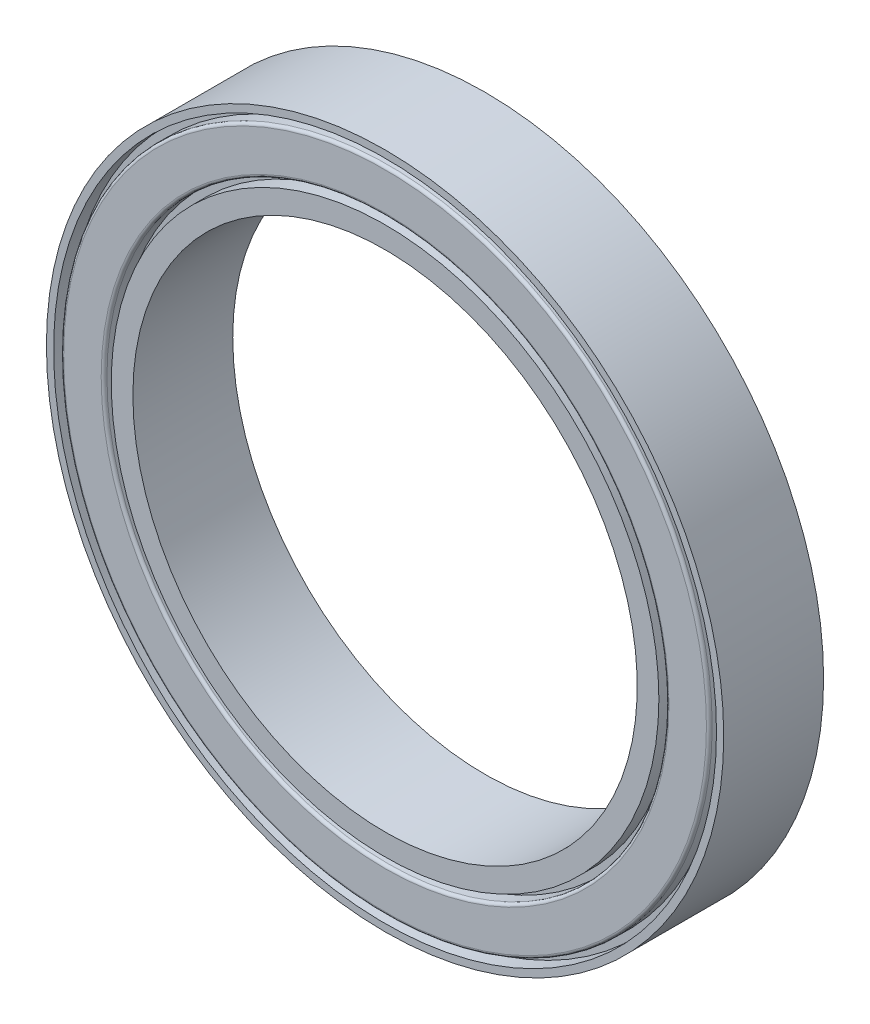
ISO-10303-21;
HEADER;
FILE_DESCRIPTION(('STEP AP214'),'2;1');
FILE_NAME('part.step','',(''),(''),'','','');
FILE_SCHEMA(('AUTOMOTIVE_DESIGN { 1 0 10303 214 1 1 1 1 }'));
ENDSEC;
DATA;
#1=APPLICATION_CONTEXT('core data for automotive mechanical design processes');
#2=APPLICATION_PROTOCOL_DEFINITION('international standard','automotive_design',2000,#1);
#3=PRODUCT_CONTEXT('',#1,'mechanical');
#4=PRODUCT('Part','Part','',(#3));
#5=PRODUCT_RELATED_PRODUCT_CATEGORY('part','',(#4));
#6=PRODUCT_DEFINITION_FORMATION('','',#4);
#7=PRODUCT_DEFINITION_CONTEXT('part definition',#1,'design');
#8=PRODUCT_DEFINITION('design','',#6,#7);
#9=PRODUCT_DEFINITION_SHAPE('','',#8);
#10=(LENGTH_UNIT() NAMED_UNIT(*) SI_UNIT(.MILLI.,.METRE.));
#11=(NAMED_UNIT(*) PLANE_ANGLE_UNIT() SI_UNIT($,.RADIAN.));
#12=(NAMED_UNIT(*) SI_UNIT($,.STERADIAN.) SOLID_ANGLE_UNIT());
#13=UNCERTAINTY_MEASURE_WITH_UNIT(LENGTH_MEASURE(1.E-05),#10,'distance_accuracy_value','');
#14=(GEOMETRIC_REPRESENTATION_CONTEXT(3) GLOBAL_UNCERTAINTY_ASSIGNED_CONTEXT((#13)) GLOBAL_UNIT_ASSIGNED_CONTEXT((#10,
#11,#12)) REPRESENTATION_CONTEXT('',''));
#15=CARTESIAN_POINT('',(0.,0.,0.));
#16=DIRECTION('',(0.,0.,1.));
#17=DIRECTION('',(1.,0.,0.));
#18=AXIS2_PLACEMENT_3D('',#15,#16,#17);
#19=CARTESIAN_POINT('',(0.,0.,0.));
#20=DIRECTION('',(0.,0.,1.));
#21=DIRECTION('',(1.,0.,0.));
#22=AXIS2_PLACEMENT_3D('',#19,#20,#21);
#23=PLANE('',#22);
#24=CARTESIAN_POINT('',(0.,0.,0.));
#25=DIRECTION('',(0.,0.,1.));
#26=DIRECTION('',(1.,0.,0.));
#27=AXIS2_PLACEMENT_3D('',#24,#25,#26);
#28=CIRCLE('',#27,17.5);
#29=CARTESIAN_POINT('',(-17.5,0.,0.));
#30=VERTEX_POINT('',#29);
#31=EDGE_CURVE('E90',#30,#30,#28,.T.);
#32=ORIENTED_EDGE('',*,*,#31,.T.);
#33=EDGE_LOOP('',(#32));
#34=FACE_BOUND('',#33,.T.);
#35=CARTESIAN_POINT('',(0.,0.,0.));
#36=DIRECTION('',(0.,0.,1.));
#37=DIRECTION('',(1.,0.,0.));
#38=AXIS2_PLACEMENT_3D('',#35,#36,#37);
#39=CIRCLE('',#38,19.);
#40=CARTESIAN_POINT('',(19.,0.,0.));
#41=VERTEX_POINT('',#40);
#42=EDGE_CURVE('E126',#41,#41,#39,.T.);
#43=ORIENTED_EDGE('',*,*,#42,.F.);
#44=EDGE_LOOP('',(#43));
#45=FACE_BOUND('',#44,.T.);
#46=ADVANCED_FACE('F51',(#34,#45),#23,.F.);
#47=CARTESIAN_POINT('',(0.,0.,0.));
#48=DIRECTION('',(0.,0.,1.));
#49=DIRECTION('',(1.,0.,0.));
#50=AXIS2_PLACEMENT_3D('',#47,#48,#49);
#51=CIRCLE('',#50,19.7);
#52=CARTESIAN_POINT('',(19.7,0.,0.));
#53=VERTEX_POINT('',#52);
#54=EDGE_CURVE('E77',#53,#53,#51,.T.);
#55=ORIENTED_EDGE('',*,*,#54,.T.);
#56=EDGE_LOOP('',(#55));
#57=FACE_BOUND('',#56,.T.);
#58=CARTESIAN_POINT('',(0.,0.,0.));
#59=DIRECTION('',(0.,0.,1.));
#60=DIRECTION('',(1.,0.,0.));
#61=AXIS2_PLACEMENT_3D('',#58,#59,#60);
#62=CIRCLE('',#61,22.3);
#63=CARTESIAN_POINT('',(22.3,0.,0.));
#64=VERTEX_POINT('',#63);
#65=EDGE_CURVE('E80',#64,#64,#62,.F.);
#66=ORIENTED_EDGE('',*,*,#65,.T.);
#67=EDGE_LOOP('',(#66));
#68=FACE_BOUND('',#67,.T.);
#69=ADVANCED_FACE('F143',(#57,#68),#23,.F.);
#70=CARTESIAN_POINT('',(0.,0.,6.93));
#71=DIRECTION('',(0.,0.,1.));
#72=DIRECTION('',(1.,0.,0.));
#73=AXIS2_PLACEMENT_3D('',#70,#71,#72);
#74=PLANE('',#73);
#75=CARTESIAN_POINT('',(0.,0.,6.93));
#76=DIRECTION('',(0.,0.,1.));
#77=DIRECTION('',(1.,0.,0.));
#78=AXIS2_PLACEMENT_3D('',#75,#76,#77);
#79=CIRCLE('',#78,17.5);
#80=CARTESIAN_POINT('',(-17.5,0.,6.93));
#81=VERTEX_POINT('',#80);
#82=EDGE_CURVE('E87',#81,#81,#79,.T.);
#83=ORIENTED_EDGE('',*,*,#82,.F.);
#84=EDGE_LOOP('',(#83));
#85=FACE_BOUND('',#84,.T.);
#86=CARTESIAN_POINT('',(0.,0.,6.93));
#87=DIRECTION('',(0.,0.,1.));
#88=DIRECTION('',(1.,0.,0.));
#89=AXIS2_PLACEMENT_3D('',#86,#87,#88);
#90=CIRCLE('',#89,19.);
#91=CARTESIAN_POINT('',(19.,0.,6.93));
#92=VERTEX_POINT('',#91);
#93=EDGE_CURVE('E108',#92,#92,#90,.T.);
#94=ORIENTED_EDGE('',*,*,#93,.T.);
#95=EDGE_LOOP('',(#94));
#96=FACE_BOUND('',#95,.T.);
#97=ADVANCED_FACE('F150',(#85,#96),#74,.T.);
#98=CARTESIAN_POINT('',(0.,0.,6.93));
#99=DIRECTION('',(0.,0.,1.));
#100=DIRECTION('',(1.,0.,0.));
#101=AXIS2_PLACEMENT_3D('',#98,#99,#100);
#102=CIRCLE('',#101,19.7);
#103=CARTESIAN_POINT('',(19.7,0.,6.93));
#104=VERTEX_POINT('',#103);
#105=EDGE_CURVE('E58',#104,#104,#102,.F.);
#106=ORIENTED_EDGE('',*,*,#105,.T.);
#107=EDGE_LOOP('',(#106));
#108=FACE_BOUND('',#107,.T.);
#109=CARTESIAN_POINT('',(0.,0.,6.93));
#110=DIRECTION('',(0.,0.,1.));
#111=DIRECTION('',(1.,0.,0.));
#112=AXIS2_PLACEMENT_3D('',#109,#110,#111);
#113=CIRCLE('',#112,22.3);
#114=CARTESIAN_POINT('',(22.3,0.,6.93));
#115=VERTEX_POINT('',#114);
#116=EDGE_CURVE('E62',#115,#115,#113,.T.);
#117=ORIENTED_EDGE('',*,*,#116,.T.);
#118=EDGE_LOOP('',(#117));
#119=FACE_BOUND('',#118,.T.);
#120=ADVANCED_FACE('F164',(#108,#119),#74,.T.);
#121=CARTESIAN_POINT('',(0.,0.,6.93));
#122=DIRECTION('',(0.,0.,1.));
#123=DIRECTION('',(1.,0.,0.));
#124=AXIS2_PLACEMENT_3D('',#121,#122,#123);
#125=CIRCLE('',#124,23.);
#126=CARTESIAN_POINT('',(23.,0.,6.93));
#127=VERTEX_POINT('',#126);
#128=EDGE_CURVE('E96',#127,#127,#125,.T.);
#129=ORIENTED_EDGE('',*,*,#128,.F.);
#130=EDGE_LOOP('',(#129));
#131=FACE_BOUND('',#130,.T.);
#132=CARTESIAN_POINT('',(0.,0.,6.93));
#133=DIRECTION('',(0.,0.,1.));
#134=DIRECTION('',(1.,0.,0.));
#135=AXIS2_PLACEMENT_3D('',#132,#133,#134);
#136=CIRCLE('',#135,23.5);
#137=CARTESIAN_POINT('',(-23.5,0.,6.93));
#138=VERTEX_POINT('',#137);
#139=EDGE_CURVE('E83',#138,#138,#136,.T.);
#140=ORIENTED_EDGE('',*,*,#139,.T.);
#141=EDGE_LOOP('',(#140));
#142=FACE_BOUND('',#141,.T.);
#143=ADVANCED_FACE('F156',(#131,#142),#74,.T.);
#144=CARTESIAN_POINT('',(0.,0.,0.));
#145=DIRECTION('',(0.,0.,1.));
#146=DIRECTION('',(1.,0.,0.));
#147=AXIS2_PLACEMENT_3D('',#144,#145,#146);
#148=CIRCLE('',#147,23.);
#149=CARTESIAN_POINT('',(23.,0.,0.));
#150=VERTEX_POINT('',#149);
#151=EDGE_CURVE('E114',#150,#150,#148,.T.);
#152=ORIENTED_EDGE('',*,*,#151,.T.);
#153=EDGE_LOOP('',(#152));
#154=FACE_BOUND('',#153,.T.);
#155=CARTESIAN_POINT('',(0.,0.,0.));
#156=DIRECTION('',(0.,0.,1.));
#157=DIRECTION('',(1.,0.,0.));
#158=AXIS2_PLACEMENT_3D('',#155,#156,#157);
#159=CIRCLE('',#158,23.5);
#160=CARTESIAN_POINT('',(-23.5,0.,0.));
#161=VERTEX_POINT('',#160);
#162=EDGE_CURVE('E84',#161,#161,#159,.T.);
#163=ORIENTED_EDGE('',*,*,#162,.F.);
#164=EDGE_LOOP('',(#163));
#165=FACE_BOUND('',#164,.T.);
#166=ADVANCED_FACE('F146',(#154,#165),#23,.F.);
#167=CARTESIAN_POINT('',(0.,0.,6.93));
#168=DIRECTION('',(0.,0.,-1.));
#169=DIRECTION('',(-1.,0.,0.));
#170=AXIS2_PLACEMENT_3D('',#167,#168,#169);
#171=CYLINDRICAL_SURFACE('',#170,23.5);
#172=CARTESIAN_POINT('',(-23.5,0.,6.93));
#173=CARTESIAN_POINT('',(-23.5,0.,6.8578125));
#174=CARTESIAN_POINT('',(-23.5,0.,6.785625));
#175=CARTESIAN_POINT('',(-23.5,0.,6.64125));
#176=CARTESIAN_POINT('',(-23.5,0.,6.5690625));
#177=CARTESIAN_POINT('',(-23.5,0.,6.4246875));
#178=CARTESIAN_POINT('',(-23.5,0.,6.3525));
#179=CARTESIAN_POINT('',(-23.5,0.,6.208125));
#180=CARTESIAN_POINT('',(-23.5,0.,6.1359375));
#181=CARTESIAN_POINT('',(-23.5,0.,5.9915625));
#182=CARTESIAN_POINT('',(-23.5,0.,5.919375));
#183=CARTESIAN_POINT('',(-23.5,0.,5.775));
#184=CARTESIAN_POINT('',(-23.5,0.,5.7028125));
#185=CARTESIAN_POINT('',(-23.5,0.,5.5584375));
#186=CARTESIAN_POINT('',(-23.5,0.,5.48625));
#187=CARTESIAN_POINT('',(-23.5,0.,5.341875));
#188=CARTESIAN_POINT('',(-23.5,0.,5.2696875));
#189=CARTESIAN_POINT('',(-23.5,0.,5.1253125));
#190=CARTESIAN_POINT('',(-23.5,0.,5.053125));
#191=CARTESIAN_POINT('',(-23.5,0.,4.90875));
#192=CARTESIAN_POINT('',(-23.5,0.,4.8365625));
#193=CARTESIAN_POINT('',(-23.5,0.,4.6921875));
#194=CARTESIAN_POINT('',(-23.5,0.,4.62));
#195=CARTESIAN_POINT('',(-23.5,0.,4.475625));
#196=CARTESIAN_POINT('',(-23.5,0.,4.4034375));
#197=CARTESIAN_POINT('',(-23.5,0.,4.2590625));
#198=CARTESIAN_POINT('',(-23.5,0.,4.186875));
#199=CARTESIAN_POINT('',(-23.5,0.,4.0425));
#200=CARTESIAN_POINT('',(-23.5,0.,3.9703125));
#201=CARTESIAN_POINT('',(-23.5,0.,3.8259375));
#202=CARTESIAN_POINT('',(-23.5,0.,3.75375));
#203=CARTESIAN_POINT('',(-23.5,0.,3.609375));
#204=CARTESIAN_POINT('',(-23.5,0.,3.5371875));
#205=CARTESIAN_POINT('',(-23.5,0.,3.3928125));
#206=CARTESIAN_POINT('',(-23.5,0.,3.320625));
#207=CARTESIAN_POINT('',(-23.5,0.,3.17625));
#208=CARTESIAN_POINT('',(-23.5,0.,3.1040625));
#209=CARTESIAN_POINT('',(-23.5,0.,2.9596875));
#210=CARTESIAN_POINT('',(-23.5,0.,2.8875));
#211=CARTESIAN_POINT('',(-23.5,0.,2.743125));
#212=CARTESIAN_POINT('',(-23.5,0.,2.6709375));
#213=CARTESIAN_POINT('',(-23.5,0.,2.5265625));
#214=CARTESIAN_POINT('',(-23.5,0.,2.454375));
#215=CARTESIAN_POINT('',(-23.5,0.,2.31));
#216=CARTESIAN_POINT('',(-23.5,0.,2.2378125));
#217=CARTESIAN_POINT('',(-23.5,0.,2.0934375));
#218=CARTESIAN_POINT('',(-23.5,0.,2.02125));
#219=CARTESIAN_POINT('',(-23.5,0.,1.876875));
#220=CARTESIAN_POINT('',(-23.5,0.,1.8046875));
#221=CARTESIAN_POINT('',(-23.5,0.,1.6603125));
#222=CARTESIAN_POINT('',(-23.5,0.,1.588125));
#223=CARTESIAN_POINT('',(-23.5,0.,1.44375));
#224=CARTESIAN_POINT('',(-23.5,0.,1.3715625));
#225=CARTESIAN_POINT('',(-23.5,0.,1.2271875));
#226=CARTESIAN_POINT('',(-23.5,0.,1.155));
#227=CARTESIAN_POINT('',(-23.5,0.,1.010625));
#228=CARTESIAN_POINT('',(-23.5,0.,0.9384375));
#229=CARTESIAN_POINT('',(-23.5,0.,0.7940625));
#230=CARTESIAN_POINT('',(-23.5,0.,0.721875));
#231=CARTESIAN_POINT('',(-23.5,0.,0.5775));
#232=CARTESIAN_POINT('',(-23.5,0.,0.5053125));
#233=CARTESIAN_POINT('',(-23.5,0.,0.3609375));
#234=CARTESIAN_POINT('',(-23.5,0.,0.28875));
#235=CARTESIAN_POINT('',(-23.5,0.,0.144375));
#236=CARTESIAN_POINT('',(-23.5,0.,0.0721874999999999));
#237=CARTESIAN_POINT('',(-23.5,0.,0.));
#238=B_SPLINE_CURVE_WITH_KNOTS('',3,(#172,#173,#174,#175,#176,#177,#178,#179,#180,#181,#182,
#183,#184,#185,#186,#187,#188,#189,#190,#191,#192,#193,#194,#195,#196,#197,#198,#199,#200,#201,
#202,#203,#204,#205,#206,#207,#208,#209,#210,#211,#212,#213,#214,#215,#216,#217,#218,#219,#220,
#221,#222,#223,#224,#225,#226,#227,#228,#229,#230,#231,#232,#233,#234,#235,#236,#237),
.UNSPECIFIED.,.F.,.F.,(4,2,2,2,2,2,2,2,2,2,2,2,2,2,2,2,2,2,2,2,2,2,2,2,2,2,2,2,2,2,2,2,4),(0.,
0.2165625,0.433124999999999,0.649687499999999,0.866249999999999,1.0828125,1.299375,1.5159375,
1.7325,1.9490625,2.165625,2.3821875,2.59875,2.8153125,3.031875,3.2484375,3.465,3.6815625,
3.898125,4.1146875,4.33125,4.5478125,4.764375,4.9809375,5.1975,5.4140625,5.630625,5.8471875,
6.06375,6.2803125,6.496875,6.7134375,6.93),.UNSPECIFIED.);
#239=EDGE_CURVE('BSEAM155',#138,#161,#238,.T.);
#240=ORIENTED_EDGE('',*,*,#139,.F.);
#241=ORIENTED_EDGE('',*,*,#162,.T.);
#242=ORIENTED_EDGE('',*,*,#239,.T.);
#243=ORIENTED_EDGE('',*,*,#239,.F.);
#244=EDGE_LOOP('',(#240,#242,#241,#243));
#245=FACE_BOUND('',#244,.T.);
#246=ADVANCED_FACE('F155',(#245),#171,.T.);
#247=CARTESIAN_POINT('',(0.,0.,6.93));
#248=DIRECTION('',(0.,0.,-1.));
#249=DIRECTION('',(-1.,0.,0.));
#250=AXIS2_PLACEMENT_3D('',#247,#248,#249);
#251=CYLINDRICAL_SURFACE('',#250,17.5);
#252=CARTESIAN_POINT('',(-17.5,0.,6.93));
#253=CARTESIAN_POINT('',(-17.5,0.,6.8578125));
#254=CARTESIAN_POINT('',(-17.5,0.,6.785625));
#255=CARTESIAN_POINT('',(-17.5,0.,6.64125));
#256=CARTESIAN_POINT('',(-17.5,0.,6.5690625));
#257=CARTESIAN_POINT('',(-17.5,0.,6.4246875));
#258=CARTESIAN_POINT('',(-17.5,0.,6.3525));
#259=CARTESIAN_POINT('',(-17.5,0.,6.208125));
#260=CARTESIAN_POINT('',(-17.5,0.,6.1359375));
#261=CARTESIAN_POINT('',(-17.5,0.,5.9915625));
#262=CARTESIAN_POINT('',(-17.5,0.,5.919375));
#263=CARTESIAN_POINT('',(-17.5,0.,5.775));
#264=CARTESIAN_POINT('',(-17.5,0.,5.7028125));
#265=CARTESIAN_POINT('',(-17.5,0.,5.5584375));
#266=CARTESIAN_POINT('',(-17.5,0.,5.48625));
#267=CARTESIAN_POINT('',(-17.5,0.,5.341875));
#268=CARTESIAN_POINT('',(-17.5,0.,5.2696875));
#269=CARTESIAN_POINT('',(-17.5,0.,5.1253125));
#270=CARTESIAN_POINT('',(-17.5,0.,5.053125));
#271=CARTESIAN_POINT('',(-17.5,0.,4.90875));
#272=CARTESIAN_POINT('',(-17.5,0.,4.8365625));
#273=CARTESIAN_POINT('',(-17.5,0.,4.6921875));
#274=CARTESIAN_POINT('',(-17.5,0.,4.62));
#275=CARTESIAN_POINT('',(-17.5,0.,4.475625));
#276=CARTESIAN_POINT('',(-17.5,0.,4.4034375));
#277=CARTESIAN_POINT('',(-17.5,0.,4.2590625));
#278=CARTESIAN_POINT('',(-17.5,0.,4.186875));
#279=CARTESIAN_POINT('',(-17.5,0.,4.0425));
#280=CARTESIAN_POINT('',(-17.5,0.,3.9703125));
#281=CARTESIAN_POINT('',(-17.5,0.,3.8259375));
#282=CARTESIAN_POINT('',(-17.5,0.,3.75375));
#283=CARTESIAN_POINT('',(-17.5,0.,3.609375));
#284=CARTESIAN_POINT('',(-17.5,0.,3.5371875));
#285=CARTESIAN_POINT('',(-17.5,0.,3.3928125));
#286=CARTESIAN_POINT('',(-17.5,0.,3.320625));
#287=CARTESIAN_POINT('',(-17.5,0.,3.17625));
#288=CARTESIAN_POINT('',(-17.5,0.,3.1040625));
#289=CARTESIAN_POINT('',(-17.5,0.,2.9596875));
#290=CARTESIAN_POINT('',(-17.5,0.,2.8875));
#291=CARTESIAN_POINT('',(-17.5,0.,2.743125));
#292=CARTESIAN_POINT('',(-17.5,0.,2.6709375));
#293=CARTESIAN_POINT('',(-17.5,0.,2.5265625));
#294=CARTESIAN_POINT('',(-17.5,0.,2.454375));
#295=CARTESIAN_POINT('',(-17.5,0.,2.31));
#296=CARTESIAN_POINT('',(-17.5,0.,2.2378125));
#297=CARTESIAN_POINT('',(-17.5,0.,2.0934375));
#298=CARTESIAN_POINT('',(-17.5,0.,2.02125));
#299=CARTESIAN_POINT('',(-17.5,0.,1.876875));
#300=CARTESIAN_POINT('',(-17.5,0.,1.8046875));
#301=CARTESIAN_POINT('',(-17.5,0.,1.6603125));
#302=CARTESIAN_POINT('',(-17.5,0.,1.588125));
#303=CARTESIAN_POINT('',(-17.5,0.,1.44375));
#304=CARTESIAN_POINT('',(-17.5,0.,1.3715625));
#305=CARTESIAN_POINT('',(-17.5,0.,1.2271875));
#306=CARTESIAN_POINT('',(-17.5,0.,1.155));
#307=CARTESIAN_POINT('',(-17.5,0.,1.010625));
#308=CARTESIAN_POINT('',(-17.5,0.,0.9384375));
#309=CARTESIAN_POINT('',(-17.5,0.,0.7940625));
#310=CARTESIAN_POINT('',(-17.5,0.,0.721875));
#311=CARTESIAN_POINT('',(-17.5,0.,0.5775));
#312=CARTESIAN_POINT('',(-17.5,0.,0.5053125));
#313=CARTESIAN_POINT('',(-17.5,0.,0.3609375));
#314=CARTESIAN_POINT('',(-17.5,0.,0.28875));
#315=CARTESIAN_POINT('',(-17.5,0.,0.144375));
#316=CARTESIAN_POINT('',(-17.5,0.,0.0721874999999999));
#317=CARTESIAN_POINT('',(-17.5,0.,0.));
#318=B_SPLINE_CURVE_WITH_KNOTS('',3,(#252,#253,#254,#255,#256,#257,#258,#259,#260,#261,#262,
#263,#264,#265,#266,#267,#268,#269,#270,#271,#272,#273,#274,#275,#276,#277,#278,#279,#280,#281,
#282,#283,#284,#285,#286,#287,#288,#289,#290,#291,#292,#293,#294,#295,#296,#297,#298,#299,#300,
#301,#302,#303,#304,#305,#306,#307,#308,#309,#310,#311,#312,#313,#314,#315,#316,#317),
.UNSPECIFIED.,.F.,.F.,(4,2,2,2,2,2,2,2,2,2,2,2,2,2,2,2,2,2,2,2,2,2,2,2,2,2,2,2,2,2,2,2,4),(0.,
0.2165625,0.433124999999999,0.649687499999999,0.866249999999999,1.0828125,1.299375,1.5159375,
1.7325,1.9490625,2.165625,2.3821875,2.59875,2.8153125,3.031875,3.2484375,3.465,3.6815625,
3.898125,4.1146875,4.33125,4.5478125,4.764375,4.9809375,5.1975,5.4140625,5.630625,5.8471875,
6.06375,6.2803125,6.496875,6.7134375,6.93),.UNSPECIFIED.);
#319=EDGE_CURVE('BSEAM162',#81,#30,#318,.T.);
#320=ORIENTED_EDGE('',*,*,#82,.T.);
#321=ORIENTED_EDGE('',*,*,#31,.F.);
#322=ORIENTED_EDGE('',*,*,#319,.T.);
#323=ORIENTED_EDGE('',*,*,#319,.F.);
#324=EDGE_LOOP('',(#320,#322,#321,#323));
#325=FACE_BOUND('',#324,.T.);
#326=ADVANCED_FACE('F162',(#325),#251,.F.);
#327=CARTESIAN_POINT('',(0.,0.,5.93));
#328=DIRECTION('',(0.,0.,1.));
#329=DIRECTION('',(1.,0.,0.));
#330=AXIS2_PLACEMENT_3D('',#327,#328,#329);
#331=CYLINDRICAL_SURFACE('',#330,23.);
#332=CARTESIAN_POINT('',(0.,0.,5.93));
#333=DIRECTION('',(0.,0.,1.));
#334=DIRECTION('',(1.,0.,0.));
#335=AXIS2_PLACEMENT_3D('',#332,#333,#334);
#336=CIRCLE('',#335,23.);
#337=CARTESIAN_POINT('',(23.,0.,5.93));
#338=VERTEX_POINT('',#337);
#339=EDGE_CURVE('E93',#338,#338,#336,.T.);
#340=ORIENTED_EDGE('',*,*,#339,.F.);
#341=EDGE_LOOP('',(#340));
#342=FACE_BOUND('',#341,.T.);
#343=ORIENTED_EDGE('',*,*,#128,.T.);
#344=EDGE_LOOP('',(#343));
#345=FACE_BOUND('',#344,.T.);
#346=ADVANCED_FACE('F204',(#342,#345),#331,.F.);
#347=CARTESIAN_POINT('',(0.,0.,5.93));
#348=DIRECTION('',(0.,0.,1.));
#349=DIRECTION('',(1.,0.,0.));
#350=AXIS2_PLACEMENT_3D('',#347,#348,#349);
#351=PLANE('',#350);
#352=CARTESIAN_POINT('',(0.,0.,5.93));
#353=DIRECTION('',(0.,0.,1.));
#354=DIRECTION('',(1.,0.,0.));
#355=AXIS2_PLACEMENT_3D('',#352,#353,#354);
#356=CIRCLE('',#355,22.5);
#357=CARTESIAN_POINT('',(22.5,0.,5.93));
#358=VERTEX_POINT('',#357);
#359=EDGE_CURVE('E99',#358,#358,#356,.T.);
#360=ORIENTED_EDGE('',*,*,#359,.F.);
#361=EDGE_LOOP('',(#360));
#362=FACE_BOUND('',#361,.T.);
#363=ORIENTED_EDGE('',*,*,#339,.T.);
#364=EDGE_LOOP('',(#363));
#365=FACE_BOUND('',#364,.T.);
#366=ADVANCED_FACE('F201',(#362,#365),#351,.T.);
#367=CARTESIAN_POINT('',(0.,0.,5.93));
#368=DIRECTION('',(0.,0.,1.));
#369=DIRECTION('',(1.,0.,0.));
#370=AXIS2_PLACEMENT_3D('',#367,#368,#369);
#371=CYLINDRICAL_SURFACE('',#370,22.5);
#372=CARTESIAN_POINT('',(0.,0.,6.73));
#373=DIRECTION('',(0.,0.,1.));
#374=DIRECTION('',(1.,0.,0.));
#375=AXIS2_PLACEMENT_3D('',#372,#373,#374);
#376=CIRCLE('',#375,22.5);
#377=CARTESIAN_POINT('',(22.5,0.,6.73));
#378=VERTEX_POINT('',#377);
#379=EDGE_CURVE('E11',#378,#378,#376,.F.);
#380=ORIENTED_EDGE('',*,*,#379,.T.);
#381=EDGE_LOOP('',(#380));
#382=FACE_BOUND('',#381,.T.);
#383=ORIENTED_EDGE('',*,*,#359,.T.);
#384=EDGE_LOOP('',(#383));
#385=FACE_BOUND('',#384,.T.);
#386=ADVANCED_FACE('F197',(#382,#385),#371,.T.);
#387=CARTESIAN_POINT('',(0.,0.,5.93));
#388=DIRECTION('',(0.,0.,1.));
#389=DIRECTION('',(1.,0.,0.));
#390=AXIS2_PLACEMENT_3D('',#387,#388,#389);
#391=CYLINDRICAL_SURFACE('',#390,19.5);
#392=CARTESIAN_POINT('',(0.,0.,6.73));
#393=DIRECTION('',(0.,0.,1.));
#394=DIRECTION('',(1.,0.,0.));
#395=AXIS2_PLACEMENT_3D('',#392,#393,#394);
#396=CIRCLE('',#395,19.5);
#397=CARTESIAN_POINT('',(19.5,0.,6.73));
#398=VERTEX_POINT('',#397);
#399=EDGE_CURVE('E66',#398,#398,#396,.T.);
#400=ORIENTED_EDGE('',*,*,#399,.T.);
#401=EDGE_LOOP('',(#400));
#402=FACE_BOUND('',#401,.T.);
#403=CARTESIAN_POINT('',(0.,0.,5.93));
#404=DIRECTION('',(0.,0.,1.));
#405=DIRECTION('',(1.,0.,0.));
#406=AXIS2_PLACEMENT_3D('',#403,#404,#405);
#407=CIRCLE('',#406,19.5);
#408=CARTESIAN_POINT('',(19.5,0.,5.93));
#409=VERTEX_POINT('',#408);
#410=EDGE_CURVE('E104',#409,#409,#407,.T.);
#411=ORIENTED_EDGE('',*,*,#410,.F.);
#412=EDGE_LOOP('',(#411));
#413=FACE_BOUND('',#412,.T.);
#414=ADVANCED_FACE('F193',(#402,#413),#391,.F.);
#415=CARTESIAN_POINT('',(0.,0.,5.93));
#416=DIRECTION('',(0.,0.,1.));
#417=DIRECTION('',(1.,0.,0.));
#418=AXIS2_PLACEMENT_3D('',#415,#416,#417);
#419=PLANE('',#418);
#420=CARTESIAN_POINT('',(0.,0.,5.93));
#421=DIRECTION('',(0.,0.,1.));
#422=DIRECTION('',(1.,0.,0.));
#423=AXIS2_PLACEMENT_3D('',#420,#421,#422);
#424=CIRCLE('',#423,19.);
#425=CARTESIAN_POINT('',(19.,0.,5.93));
#426=VERTEX_POINT('',#425);
#427=EDGE_CURVE('E107',#426,#426,#424,.T.);
#428=ORIENTED_EDGE('',*,*,#427,.F.);
#429=EDGE_LOOP('',(#428));
#430=FACE_BOUND('',#429,.T.);
#431=ORIENTED_EDGE('',*,*,#410,.T.);
#432=EDGE_LOOP('',(#431));
#433=FACE_BOUND('',#432,.T.);
#434=ADVANCED_FACE('F189',(#430,#433),#419,.T.);
#435=CARTESIAN_POINT('',(0.,0.,5.93));
#436=DIRECTION('',(0.,0.,1.));
#437=DIRECTION('',(1.,0.,0.));
#438=AXIS2_PLACEMENT_3D('',#435,#436,#437);
#439=CYLINDRICAL_SURFACE('',#438,19.);
#440=ORIENTED_EDGE('',*,*,#427,.T.);
#441=EDGE_LOOP('',(#440));
#442=FACE_BOUND('',#441,.T.);
#443=ORIENTED_EDGE('',*,*,#93,.F.);
#444=EDGE_LOOP('',(#443));
#445=FACE_BOUND('',#444,.T.);
#446=ADVANCED_FACE('F183',(#442,#445),#439,.T.);
#447=CARTESIAN_POINT('',(0.,0.,1.));
#448=DIRECTION('',(0.,0.,-1.));
#449=DIRECTION('',(1.,0.,0.));
#450=AXIS2_PLACEMENT_3D('',#447,#448,#449);
#451=PLANE('',#450);
#452=CARTESIAN_POINT('',(0.,0.,1.));
#453=DIRECTION('',(0.,0.,1.));
#454=DIRECTION('',(1.,0.,0.));
#455=AXIS2_PLACEMENT_3D('',#452,#453,#454);
#456=CIRCLE('',#455,23.);
#457=CARTESIAN_POINT('',(23.,0.,1.));
#458=VERTEX_POINT('',#457);
#459=EDGE_CURVE('E111',#458,#458,#456,.T.);
#460=ORIENTED_EDGE('',*,*,#459,.F.);
#461=EDGE_LOOP('',(#460));
#462=FACE_BOUND('',#461,.T.);
#463=CARTESIAN_POINT('',(0.,0.,1.));
#464=DIRECTION('',(0.,0.,1.));
#465=DIRECTION('',(1.,0.,0.));
#466=AXIS2_PLACEMENT_3D('',#463,#464,#465);
#467=CIRCLE('',#466,22.5);
#468=CARTESIAN_POINT('',(22.5,0.,1.));
#469=VERTEX_POINT('',#468);
#470=EDGE_CURVE('E117',#469,#469,#467,.T.);
#471=ORIENTED_EDGE('',*,*,#470,.T.);
#472=EDGE_LOOP('',(#471));
#473=FACE_BOUND('',#472,.T.);
#474=ADVANCED_FACE('F174',(#462,#473),#451,.T.);
#475=CARTESIAN_POINT('',(0.,0.,1.));
#476=DIRECTION('',(0.,0.,-1.));
#477=DIRECTION('',(-1.,0.,0.));
#478=AXIS2_PLACEMENT_3D('',#475,#476,#477);
#479=CYLINDRICAL_SURFACE('',#478,23.);
#480=ORIENTED_EDGE('',*,*,#459,.T.);
#481=EDGE_LOOP('',(#480));
#482=FACE_BOUND('',#481,.T.);
#483=ORIENTED_EDGE('',*,*,#151,.F.);
#484=EDGE_LOOP('',(#483));
#485=FACE_BOUND('',#484,.T.);
#486=ADVANCED_FACE('F171',(#482,#485),#479,.F.);
#487=CARTESIAN_POINT('',(0.,0.,1.));
#488=DIRECTION('',(0.,0.,-1.));
#489=DIRECTION('',(-1.,0.,0.));
#490=AXIS2_PLACEMENT_3D('',#487,#488,#489);
#491=CYLINDRICAL_SURFACE('',#490,22.5);
#492=CARTESIAN_POINT('',(0.,0.,0.2));
#493=DIRECTION('',(0.,0.,1.));
#494=DIRECTION('',(1.,0.,0.));
#495=AXIS2_PLACEMENT_3D('',#492,#493,#494);
#496=CIRCLE('',#495,22.5);
#497=CARTESIAN_POINT('',(22.5,0.,0.2));
#498=VERTEX_POINT('',#497);
#499=EDGE_CURVE('E71',#498,#498,#496,.T.);
#500=ORIENTED_EDGE('',*,*,#499,.T.);
#501=EDGE_LOOP('',(#500));
#502=FACE_BOUND('',#501,.T.);
#503=ORIENTED_EDGE('',*,*,#470,.F.);
#504=EDGE_LOOP('',(#503));
#505=FACE_BOUND('',#504,.T.);
#506=ADVANCED_FACE('F173',(#502,#505),#491,.T.);
#507=CARTESIAN_POINT('',(0.,0.,1.));
#508=DIRECTION('',(0.,0.,-1.));
#509=DIRECTION('',(1.,0.,0.));
#510=AXIS2_PLACEMENT_3D('',#507,#508,#509);
#511=PLANE('',#510);
#512=CARTESIAN_POINT('',(0.,0.,1.));
#513=DIRECTION('',(0.,0.,1.));
#514=DIRECTION('',(1.,0.,0.));
#515=AXIS2_PLACEMENT_3D('',#512,#513,#514);
#516=CIRCLE('',#515,19.5);
#517=CARTESIAN_POINT('',(19.5,0.,1.));
#518=VERTEX_POINT('',#517);
#519=EDGE_CURVE('E122',#518,#518,#516,.T.);
#520=ORIENTED_EDGE('',*,*,#519,.F.);
#521=EDGE_LOOP('',(#520));
#522=FACE_BOUND('',#521,.T.);
#523=CARTESIAN_POINT('',(0.,0.,1.));
#524=DIRECTION('',(0.,0.,1.));
#525=DIRECTION('',(1.,0.,0.));
#526=AXIS2_PLACEMENT_3D('',#523,#524,#525);
#527=CIRCLE('',#526,19.);
#528=CARTESIAN_POINT('',(19.,0.,1.));
#529=VERTEX_POINT('',#528);
#530=EDGE_CURVE('E125',#529,#529,#527,.T.);
#531=ORIENTED_EDGE('',*,*,#530,.T.);
#532=EDGE_LOOP('',(#531));
#533=FACE_BOUND('',#532,.T.);
#534=ADVANCED_FACE('F132',(#522,#533),#511,.T.);
#535=CARTESIAN_POINT('',(0.,0.,1.));
#536=DIRECTION('',(0.,0.,-1.));
#537=DIRECTION('',(-1.,0.,0.));
#538=AXIS2_PLACEMENT_3D('',#535,#536,#537);
#539=CYLINDRICAL_SURFACE('',#538,19.5);
#540=CARTESIAN_POINT('',(0.,0.,0.2));
#541=DIRECTION('',(0.,0.,1.));
#542=DIRECTION('',(1.,0.,0.));
#543=AXIS2_PLACEMENT_3D('',#540,#541,#542);
#544=CIRCLE('',#543,19.5);
#545=CARTESIAN_POINT('',(19.5,0.,0.2));
#546=VERTEX_POINT('',#545);
#547=EDGE_CURVE('E74',#546,#546,#544,.F.);
#548=ORIENTED_EDGE('',*,*,#547,.T.);
#549=EDGE_LOOP('',(#548));
#550=FACE_BOUND('',#549,.T.);
#551=ORIENTED_EDGE('',*,*,#519,.T.);
#552=EDGE_LOOP('',(#551));
#553=FACE_BOUND('',#552,.T.);
#554=ADVANCED_FACE('F138',(#550,#553),#539,.F.);
#555=CARTESIAN_POINT('',(0.,0.,1.));
#556=DIRECTION('',(0.,0.,-1.));
#557=DIRECTION('',(-1.,0.,0.));
#558=AXIS2_PLACEMENT_3D('',#555,#556,#557);
#559=CYLINDRICAL_SURFACE('',#558,19.);
#560=ORIENTED_EDGE('',*,*,#530,.F.);
#561=EDGE_LOOP('',(#560));
#562=FACE_BOUND('',#561,.T.);
#563=ORIENTED_EDGE('',*,*,#42,.T.);
#564=EDGE_LOOP('',(#563));
#565=FACE_BOUND('',#564,.T.);
#566=ADVANCED_FACE('F134',(#562,#565),#559,.T.);
#567=CARTESIAN_POINT('',(0.,0.,0.2));
#568=DIRECTION('',(0.,0.,1.));
#569=DIRECTION('',(1.,0.,0.));
#570=AXIS2_PLACEMENT_3D('',#567,#568,#569);
#571=TOROIDAL_SURFACE('',#570,19.7,0.2);
#572=ORIENTED_EDGE('',*,*,#547,.F.);
#573=EDGE_LOOP('',(#572));
#574=FACE_BOUND('',#573,.T.);
#575=ORIENTED_EDGE('',*,*,#54,.F.);
#576=EDGE_LOOP('',(#575));
#577=FACE_BOUND('',#576,.T.);
#578=ADVANCED_FACE('F137',(#574,#577),#571,.T.);
#579=CARTESIAN_POINT('',(0.,0.,0.2));
#580=DIRECTION('',(0.,0.,1.));
#581=DIRECTION('',(1.,0.,0.));
#582=AXIS2_PLACEMENT_3D('',#579,#580,#581);
#583=TOROIDAL_SURFACE('',#582,22.3,0.2);
#584=ORIENTED_EDGE('',*,*,#65,.F.);
#585=EDGE_LOOP('',(#584));
#586=FACE_BOUND('',#585,.T.);
#587=ORIENTED_EDGE('',*,*,#499,.F.);
#588=EDGE_LOOP('',(#587));
#589=FACE_BOUND('',#588,.T.);
#590=ADVANCED_FACE('F235',(#586,#589),#583,.T.);
#591=CARTESIAN_POINT('',(0.,0.,6.73));
#592=DIRECTION('',(0.,0.,1.));
#593=DIRECTION('',(1.,0.,0.));
#594=AXIS2_PLACEMENT_3D('',#591,#592,#593);
#595=TOROIDAL_SURFACE('',#594,19.7,0.2);
#596=ORIENTED_EDGE('',*,*,#105,.F.);
#597=EDGE_LOOP('',(#596));
#598=FACE_BOUND('',#597,.T.);
#599=ORIENTED_EDGE('',*,*,#399,.F.);
#600=EDGE_LOOP('',(#599));
#601=FACE_BOUND('',#600,.T.);
#602=ADVANCED_FACE('F230',(#598,#601),#595,.T.);
#603=CARTESIAN_POINT('',(0.,0.,6.73));
#604=DIRECTION('',(0.,0.,1.));
#605=DIRECTION('',(1.,0.,0.));
#606=AXIS2_PLACEMENT_3D('',#603,#604,#605);
#607=TOROIDAL_SURFACE('',#606,22.3,0.2);
#608=ORIENTED_EDGE('',*,*,#379,.F.);
#609=EDGE_LOOP('',(#608));
#610=FACE_BOUND('',#609,.T.);
#611=ORIENTED_EDGE('',*,*,#116,.F.);
#612=EDGE_LOOP('',(#611));
#613=FACE_BOUND('',#612,.T.);
#614=ADVANCED_FACE('F53',(#610,#613),#607,.T.);
#615=CLOSED_SHELL('',(#46,#69,#97,#120,#143,#166,#246,#326,#346,#366,#386,#414,#434,#446,#474,
#486,#506,#534,#554,#566,#578,#590,#602,#614));
#616=MANIFOLD_SOLID_BREP('B2',#615);
#617=ADVANCED_BREP_SHAPE_REPRESENTATION('',(#18,#616),#14);
#618=SHAPE_DEFINITION_REPRESENTATION(#9,#617);
ENDSEC;
END-ISO-10303-21;
